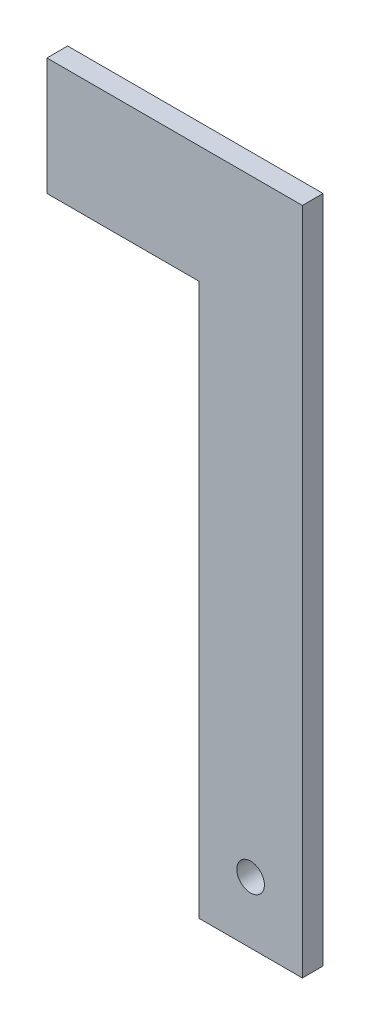
ISO-10303-21;
HEADER;
FILE_DESCRIPTION(('STEP AP214'),'2;1');
FILE_NAME('part.step','',(''),(''),'','','');
FILE_SCHEMA(('AUTOMOTIVE_DESIGN { 1 0 10303 214 1 1 1 1 }'));
ENDSEC;
DATA;
#1=APPLICATION_CONTEXT('core data for automotive mechanical design processes');
#2=APPLICATION_PROTOCOL_DEFINITION('international standard','automotive_design',2000,#1);
#3=PRODUCT_CONTEXT('',#1,'mechanical');
#4=PRODUCT('Part','Part','',(#3));
#5=PRODUCT_RELATED_PRODUCT_CATEGORY('part','',(#4));
#6=PRODUCT_DEFINITION_FORMATION('','',#4);
#7=PRODUCT_DEFINITION_CONTEXT('part definition',#1,'design');
#8=PRODUCT_DEFINITION('design','',#6,#7);
#9=PRODUCT_DEFINITION_SHAPE('','',#8);
#10=(LENGTH_UNIT() NAMED_UNIT(*) SI_UNIT(.MILLI.,.METRE.));
#11=(NAMED_UNIT(*) PLANE_ANGLE_UNIT() SI_UNIT($,.RADIAN.));
#12=(NAMED_UNIT(*) SI_UNIT($,.STERADIAN.) SOLID_ANGLE_UNIT());
#13=UNCERTAINTY_MEASURE_WITH_UNIT(LENGTH_MEASURE(1.E-05),#10,'distance_accuracy_value','');
#14=(GEOMETRIC_REPRESENTATION_CONTEXT(3) GLOBAL_UNCERTAINTY_ASSIGNED_CONTEXT((#13)) GLOBAL_UNIT_ASSIGNED_CONTEXT((#10,
#11,#12)) REPRESENTATION_CONTEXT('',''));
#15=CARTESIAN_POINT('',(0.,0.,0.));
#16=DIRECTION('',(0.,0.,1.));
#17=DIRECTION('',(1.,0.,0.));
#18=AXIS2_PLACEMENT_3D('',#15,#16,#17);
#19=CARTESIAN_POINT('',(0.,0.,3.));
#20=DIRECTION('',(0.,0.,1.));
#21=DIRECTION('',(1.,0.,0.));
#22=AXIS2_PLACEMENT_3D('',#19,#20,#21);
#23=PLANE('',#22);
#24=DIRECTION('',(-1.,0.,0.));
#25=VECTOR('',#24,1.);
#26=CARTESIAN_POINT('',(20.,60.,3.));
#27=LINE('',#26,#25);
#28=CARTESIAN_POINT('',(20.,60.,3.));
#29=VERTEX_POINT('',#28);
#30=CARTESIAN_POINT('',(-17.,60.,3.));
#31=VERTEX_POINT('',#30);
#32=EDGE_CURVE('E94',#29,#31,#27,.T.);
#33=ORIENTED_EDGE('',*,*,#32,.T.);
#34=DIRECTION('',(0.,-1.,0.));
#35=VECTOR('',#34,1.);
#36=CARTESIAN_POINT('',(-17.,60.,3.));
#37=LINE('',#36,#35);
#38=CARTESIAN_POINT('',(-17.,43.,3.));
#39=VERTEX_POINT('',#38);
#40=EDGE_CURVE('E151',#31,#39,#37,.T.);
#41=ORIENTED_EDGE('',*,*,#40,.T.);
#42=DIRECTION('',(1.,0.,0.));
#43=VECTOR('',#42,1.);
#44=CARTESIAN_POINT('',(-17.,43.,3.));
#45=LINE('',#44,#43);
#46=CARTESIAN_POINT('',(5.,43.,3.));
#47=VERTEX_POINT('',#46);
#48=EDGE_CURVE('E108',#39,#47,#45,.T.);
#49=ORIENTED_EDGE('',*,*,#48,.T.);
#50=DIRECTION('',(0.,-1.,0.));
#51=VECTOR('',#50,1.);
#52=CARTESIAN_POINT('',(5.,43.,3.));
#53=LINE('',#52,#51);
#54=CARTESIAN_POINT('',(5.00000000000001,-36.9149642695723,3.));
#55=VERTEX_POINT('',#54);
#56=EDGE_CURVE('E102',#47,#55,#53,.T.);
#57=ORIENTED_EDGE('',*,*,#56,.T.);
#58=DIRECTION('',(1.,0.,0.));
#59=VECTOR('',#58,1.);
#60=CARTESIAN_POINT('',(5.00000000000001,-36.9149642695723,3.));
#61=LINE('',#60,#59);
#62=CARTESIAN_POINT('',(20.,-36.9149642695723,3.));
#63=VERTEX_POINT('',#62);
#64=EDGE_CURVE('E106',#55,#63,#61,.T.);
#65=ORIENTED_EDGE('',*,*,#64,.T.);
#66=DIRECTION('',(0.,1.,0.));
#67=VECTOR('',#66,1.);
#68=CARTESIAN_POINT('',(20.,-36.9149642695723,3.));
#69=LINE('',#68,#67);
#70=EDGE_CURVE('E58',#63,#29,#69,.T.);
#71=ORIENTED_EDGE('',*,*,#70,.T.);
#72=EDGE_LOOP('',(#33,#41,#49,#57,#65,#71));
#73=FACE_BOUND('',#72,.T.);
#74=CARTESIAN_POINT('',(12.5,-28.,3.));
#75=DIRECTION('',(0.,0.,1.));
#76=DIRECTION('',(1.,0.,0.));
#77=AXIS2_PLACEMENT_3D('',#74,#75,#76);
#78=CIRCLE('',#77,2.);
#79=CARTESIAN_POINT('',(14.5,-28.,3.));
#80=VERTEX_POINT('',#79);
#81=EDGE_CURVE('E128',#80,#80,#78,.T.);
#82=ORIENTED_EDGE('',*,*,#81,.F.);
#83=EDGE_LOOP('',(#82));
#84=FACE_BOUND('',#83,.T.);
#85=ADVANCED_FACE('F41',(#73,#84),#23,.T.);
#86=CARTESIAN_POINT('',(0.,0.,0.));
#87=DIRECTION('',(0.,0.,1.));
#88=DIRECTION('',(1.,0.,0.));
#89=AXIS2_PLACEMENT_3D('',#86,#87,#88);
#90=PLANE('',#89);
#91=DIRECTION('',(-1.,0.,0.));
#92=VECTOR('',#91,1.);
#93=CARTESIAN_POINT('',(3.,60.,0.));
#94=LINE('',#93,#92);
#95=CARTESIAN_POINT('',(20.,60.,0.));
#96=VERTEX_POINT('',#95);
#97=CARTESIAN_POINT('',(-17.,60.,0.));
#98=VERTEX_POINT('',#97);
#99=EDGE_CURVE('E88',#96,#98,#94,.T.);
#100=ORIENTED_EDGE('',*,*,#99,.F.);
#101=DIRECTION('',(0.,1.,0.));
#102=VECTOR('',#101,1.);
#103=CARTESIAN_POINT('',(20.,-36.9149642695723,0.));
#104=LINE('',#103,#102);
#105=CARTESIAN_POINT('',(20.,-36.9149642695723,0.));
#106=VERTEX_POINT('',#105);
#107=EDGE_CURVE('E134',#106,#96,#104,.T.);
#108=ORIENTED_EDGE('',*,*,#107,.F.);
#109=DIRECTION('',(1.,0.,0.));
#110=VECTOR('',#109,1.);
#111=CARTESIAN_POINT('',(5.00000000000001,-36.9149642695723,0.));
#112=LINE('',#111,#110);
#113=CARTESIAN_POINT('',(5.00000000000001,-36.9149642695723,0.));
#114=VERTEX_POINT('',#113);
#115=EDGE_CURVE('E81',#114,#106,#112,.T.);
#116=ORIENTED_EDGE('',*,*,#115,.F.);
#117=DIRECTION('',(0.,-1.,0.));
#118=VECTOR('',#117,1.);
#119=CARTESIAN_POINT('',(5.,43.,0.));
#120=LINE('',#119,#118);
#121=CARTESIAN_POINT('',(5.,43.,0.));
#122=VERTEX_POINT('',#121);
#123=EDGE_CURVE('E116',#122,#114,#120,.T.);
#124=ORIENTED_EDGE('',*,*,#123,.F.);
#125=DIRECTION('',(1.,0.,0.));
#126=VECTOR('',#125,1.);
#127=CARTESIAN_POINT('',(-17.,43.,0.));
#128=LINE('',#127,#126);
#129=CARTESIAN_POINT('',(-17.,43.,0.));
#130=VERTEX_POINT('',#129);
#131=EDGE_CURVE('E130',#130,#122,#128,.T.);
#132=ORIENTED_EDGE('',*,*,#131,.F.);
#133=DIRECTION('',(0.,-1.,0.));
#134=VECTOR('',#133,1.);
#135=CARTESIAN_POINT('',(-17.,60.,0.));
#136=LINE('',#135,#134);
#137=EDGE_CURVE('E127',#98,#130,#136,.T.);
#138=ORIENTED_EDGE('',*,*,#137,.F.);
#139=EDGE_LOOP('',(#100,#108,#116,#124,#132,#138));
#140=FACE_BOUND('',#139,.T.);
#141=CARTESIAN_POINT('',(12.5,-28.,0.));
#142=DIRECTION('',(0.,0.,1.));
#143=DIRECTION('',(1.,0.,0.));
#144=AXIS2_PLACEMENT_3D('',#141,#142,#143);
#145=CIRCLE('',#144,2.);
#146=CARTESIAN_POINT('',(14.5,-28.,0.));
#147=VERTEX_POINT('',#146);
#148=EDGE_CURVE('E155',#147,#147,#145,.T.);
#149=ORIENTED_EDGE('',*,*,#148,.T.);
#150=EDGE_LOOP('',(#149));
#151=FACE_BOUND('',#150,.T.);
#152=ADVANCED_FACE('F146',(#140,#151),#90,.F.);
#153=CARTESIAN_POINT('',(3.,60.,3.));
#154=DIRECTION('',(0.,-1.,0.));
#155=DIRECTION('',(0.,0.,-1.));
#156=AXIS2_PLACEMENT_3D('',#153,#154,#155);
#157=PLANE('',#156);
#158=ORIENTED_EDGE('',*,*,#99,.T.);
#159=DIRECTION('',(0.,0.,-1.));
#160=VECTOR('',#159,1.);
#161=CARTESIAN_POINT('',(-17.,60.,3.));
#162=LINE('',#161,#160);
#163=EDGE_CURVE('E11',#31,#98,#162,.T.);
#164=ORIENTED_EDGE('',*,*,#163,.F.);
#165=ORIENTED_EDGE('',*,*,#32,.F.);
#166=DIRECTION('',(0.,0.,-1.));
#167=VECTOR('',#166,1.);
#168=CARTESIAN_POINT('',(20.,60.,3.));
#169=LINE('',#168,#167);
#170=EDGE_CURVE('E122',#29,#96,#169,.T.);
#171=ORIENTED_EDGE('',*,*,#170,.T.);
#172=EDGE_LOOP('',(#158,#164,#165,#171));
#173=FACE_BOUND('',#172,.T.);
#174=ADVANCED_FACE('F43',(#173),#157,.F.);
#175=CARTESIAN_POINT('',(-17.,60.,3.));
#176=DIRECTION('',(1.,0.,0.));
#177=DIRECTION('',(0.,1.,0.));
#178=AXIS2_PLACEMENT_3D('',#175,#176,#177);
#179=PLANE('',#178);
#180=ORIENTED_EDGE('',*,*,#137,.T.);
#181=DIRECTION('',(0.,0.,-1.));
#182=VECTOR('',#181,1.);
#183=CARTESIAN_POINT('',(-17.,43.,3.));
#184=LINE('',#183,#182);
#185=EDGE_CURVE('E50',#39,#130,#184,.T.);
#186=ORIENTED_EDGE('',*,*,#185,.F.);
#187=ORIENTED_EDGE('',*,*,#40,.F.);
#188=ORIENTED_EDGE('',*,*,#163,.T.);
#189=EDGE_LOOP('',(#180,#186,#187,#188));
#190=FACE_BOUND('',#189,.T.);
#191=ADVANCED_FACE('F178',(#190),#179,.F.);
#192=CARTESIAN_POINT('',(-17.,43.,3.));
#193=DIRECTION('',(0.,1.,0.));
#194=DIRECTION('',(0.,0.,1.));
#195=AXIS2_PLACEMENT_3D('',#192,#193,#194);
#196=PLANE('',#195);
#197=ORIENTED_EDGE('',*,*,#131,.T.);
#198=DIRECTION('',(0.,0.,-1.));
#199=VECTOR('',#198,1.);
#200=CARTESIAN_POINT('',(5.,43.,3.));
#201=LINE('',#200,#199);
#202=EDGE_CURVE('E117',#47,#122,#201,.T.);
#203=ORIENTED_EDGE('',*,*,#202,.F.);
#204=ORIENTED_EDGE('',*,*,#48,.F.);
#205=ORIENTED_EDGE('',*,*,#185,.T.);
#206=EDGE_LOOP('',(#197,#203,#204,#205));
#207=FACE_BOUND('',#206,.T.);
#208=ADVANCED_FACE('F143',(#207),#196,.F.);
#209=CARTESIAN_POINT('',(5.,43.,3.));
#210=DIRECTION('',(1.,0.,0.));
#211=DIRECTION('',(0.,1.,0.));
#212=AXIS2_PLACEMENT_3D('',#209,#210,#211);
#213=PLANE('',#212);
#214=ORIENTED_EDGE('',*,*,#123,.T.);
#215=DIRECTION('',(0.,0.,-1.));
#216=VECTOR('',#215,1.);
#217=CARTESIAN_POINT('',(5.00000000000001,-36.9149642695723,3.));
#218=LINE('',#217,#216);
#219=EDGE_CURVE('E113',#55,#114,#218,.T.);
#220=ORIENTED_EDGE('',*,*,#219,.F.);
#221=ORIENTED_EDGE('',*,*,#56,.F.);
#222=ORIENTED_EDGE('',*,*,#202,.T.);
#223=EDGE_LOOP('',(#214,#220,#221,#222));
#224=FACE_BOUND('',#223,.T.);
#225=ADVANCED_FACE('F114',(#224),#213,.F.);
#226=CARTESIAN_POINT('',(5.00000000000001,-36.9149642695723,3.));
#227=DIRECTION('',(0.,1.,0.));
#228=DIRECTION('',(0.,0.,1.));
#229=AXIS2_PLACEMENT_3D('',#226,#227,#228);
#230=PLANE('',#229);
#231=ORIENTED_EDGE('',*,*,#115,.T.);
#232=DIRECTION('',(0.,0.,-1.));
#233=VECTOR('',#232,1.);
#234=CARTESIAN_POINT('',(20.,-36.9149642695723,3.));
#235=LINE('',#234,#233);
#236=EDGE_CURVE('E118',#63,#106,#235,.T.);
#237=ORIENTED_EDGE('',*,*,#236,.F.);
#238=ORIENTED_EDGE('',*,*,#64,.F.);
#239=ORIENTED_EDGE('',*,*,#219,.T.);
#240=EDGE_LOOP('',(#231,#237,#238,#239));
#241=FACE_BOUND('',#240,.T.);
#242=ADVANCED_FACE('F120',(#241),#230,.F.);
#243=CARTESIAN_POINT('',(20.,-36.9149642695723,3.));
#244=DIRECTION('',(-1.,0.,0.));
#245=DIRECTION('',(0.,0.,1.));
#246=AXIS2_PLACEMENT_3D('',#243,#244,#245);
#247=PLANE('',#246);
#248=ORIENTED_EDGE('',*,*,#107,.T.);
#249=ORIENTED_EDGE('',*,*,#170,.F.);
#250=ORIENTED_EDGE('',*,*,#70,.F.);
#251=ORIENTED_EDGE('',*,*,#236,.T.);
#252=EDGE_LOOP('',(#248,#249,#250,#251));
#253=FACE_BOUND('',#252,.T.);
#254=ADVANCED_FACE('F149',(#253),#247,.F.);
#255=CARTESIAN_POINT('',(12.5,-28.,3.));
#256=DIRECTION('',(0.,0.,-1.));
#257=DIRECTION('',(-1.,0.,0.));
#258=AXIS2_PLACEMENT_3D('',#255,#256,#257);
#259=CYLINDRICAL_SURFACE('',#258,2.);
#260=ORIENTED_EDGE('',*,*,#81,.T.);
#261=EDGE_LOOP('',(#260));
#262=FACE_BOUND('',#261,.T.);
#263=ORIENTED_EDGE('',*,*,#148,.F.);
#264=EDGE_LOOP('',(#263));
#265=FACE_BOUND('',#264,.T.);
#266=ADVANCED_FACE('F161',(#262,#265),#259,.F.);
#267=CLOSED_SHELL('',(#85,#152,#174,#191,#208,#225,#242,#254,#266));
#268=MANIFOLD_SOLID_BREP('B2',#267);
#269=ADVANCED_BREP_SHAPE_REPRESENTATION('',(#18,#268),#14);
#270=SHAPE_DEFINITION_REPRESENTATION(#9,#269);
ENDSEC;
END-ISO-10303-21;
